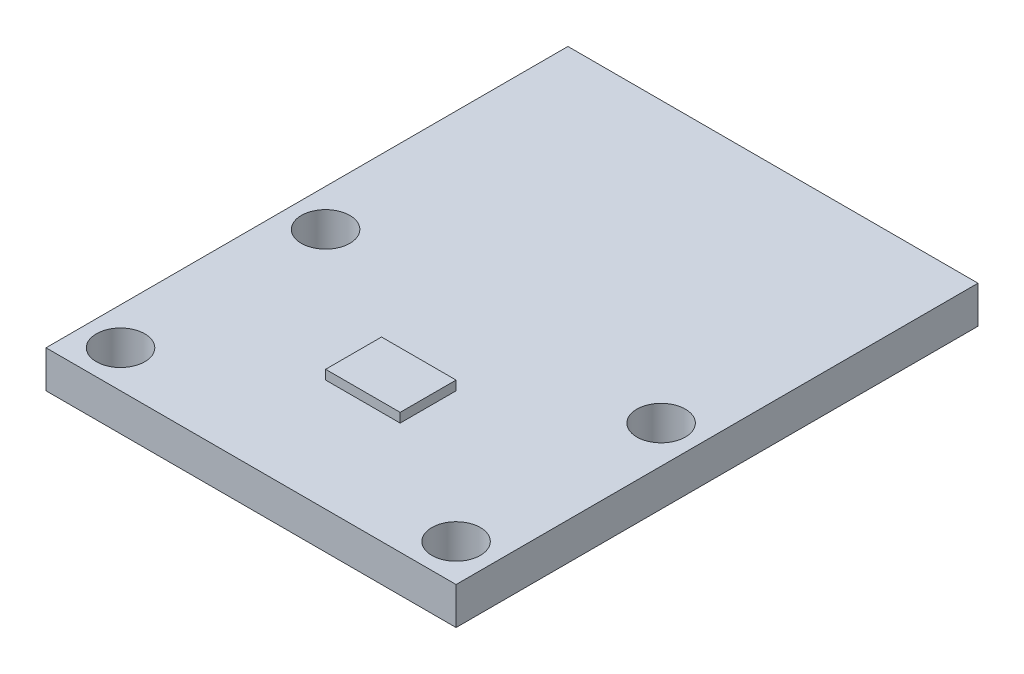
ISO-10303-21;
HEADER;
FILE_DESCRIPTION(('STEP AP214'),'2;1');
FILE_NAME('part.step','',(''),(''),'','','');
FILE_SCHEMA(('AUTOMOTIVE_DESIGN { 1 0 10303 214 1 1 1 1 }'));
ENDSEC;
DATA;
#1=APPLICATION_CONTEXT('core data for automotive mechanical design processes');
#2=APPLICATION_PROTOCOL_DEFINITION('international standard','automotive_design',2000,#1);
#3=PRODUCT_CONTEXT('',#1,'mechanical');
#4=PRODUCT('Part','Part','',(#3));
#5=PRODUCT_RELATED_PRODUCT_CATEGORY('part','',(#4));
#6=PRODUCT_DEFINITION_FORMATION('','',#4);
#7=PRODUCT_DEFINITION_CONTEXT('part definition',#1,'design');
#8=PRODUCT_DEFINITION('design','',#6,#7);
#9=PRODUCT_DEFINITION_SHAPE('','',#8);
#10=(LENGTH_UNIT() NAMED_UNIT(*) SI_UNIT(.MILLI.,.METRE.));
#11=(NAMED_UNIT(*) PLANE_ANGLE_UNIT() SI_UNIT($,.RADIAN.));
#12=(NAMED_UNIT(*) SI_UNIT($,.STERADIAN.) SOLID_ANGLE_UNIT());
#13=UNCERTAINTY_MEASURE_WITH_UNIT(LENGTH_MEASURE(1.E-05),#10,'distance_accuracy_value','');
#14=(GEOMETRIC_REPRESENTATION_CONTEXT(3) GLOBAL_UNCERTAINTY_ASSIGNED_CONTEXT((#13)) GLOBAL_UNIT_ASSIGNED_CONTEXT((#10,
#11,#12)) REPRESENTATION_CONTEXT('',''));
#15=CARTESIAN_POINT('',(0.,0.,0.));
#16=DIRECTION('',(0.,0.,1.));
#17=DIRECTION('',(1.,0.,0.));
#18=AXIS2_PLACEMENT_3D('',#15,#16,#17);
#19=CARTESIAN_POINT('',(0.,2.,0.));
#20=DIRECTION('',(0.,1.,0.));
#21=DIRECTION('',(0.,0.,1.));
#22=AXIS2_PLACEMENT_3D('',#19,#20,#21);
#23=PLANE('',#22);
#24=CARTESIAN_POINT('',(9.00000000000001,2.,1.));
#25=DIRECTION('',(0.,1.,0.));
#26=DIRECTION('',(0.,0.,1.));
#27=AXIS2_PLACEMENT_3D('',#24,#25,#26);
#28=CIRCLE('',#27,1.3);
#29=CARTESIAN_POINT('',(9.00000000000001,2.,2.3));
#30=VERTEX_POINT('',#29);
#31=EDGE_CURVE('E145',#30,#30,#28,.T.);
#32=ORIENTED_EDGE('',*,*,#31,.F.);
#33=EDGE_LOOP('',(#32));
#34=FACE_BOUND('',#33,.T.);
#35=CARTESIAN_POINT('',(9.00000000000001,2.,12.));
#36=DIRECTION('',(0.,1.,0.));
#37=DIRECTION('',(0.,0.,1.));
#38=AXIS2_PLACEMENT_3D('',#35,#36,#37);
#39=CIRCLE('',#38,1.3);
#40=CARTESIAN_POINT('',(9.00000000000001,2.,13.3));
#41=VERTEX_POINT('',#40);
#42=EDGE_CURVE('E157',#41,#41,#39,.T.);
#43=ORIENTED_EDGE('',*,*,#42,.F.);
#44=EDGE_LOOP('',(#43));
#45=FACE_BOUND('',#44,.T.);
#46=DIRECTION('',(0.,0.,-1.));
#47=VECTOR('',#46,1.);
#48=CARTESIAN_POINT('',(11.,2.,-14.));
#49=LINE('',#48,#47);
#50=CARTESIAN_POINT('',(11.,2.,14.));
#51=VERTEX_POINT('',#50);
#52=CARTESIAN_POINT('',(11.,2.,-14.));
#53=VERTEX_POINT('',#52);
#54=EDGE_CURVE('E163',#51,#53,#49,.T.);
#55=ORIENTED_EDGE('',*,*,#54,.T.);
#56=DIRECTION('',(-1.,0.,0.));
#57=VECTOR('',#56,1.);
#58=CARTESIAN_POINT('',(-11.,2.,-14.));
#59=LINE('',#58,#57);
#60=CARTESIAN_POINT('',(-11.,2.,-14.));
#61=VERTEX_POINT('',#60);
#62=EDGE_CURVE('E87',#53,#61,#59,.T.);
#63=ORIENTED_EDGE('',*,*,#62,.T.);
#64=DIRECTION('',(0.,0.,1.));
#65=VECTOR('',#64,1.);
#66=CARTESIAN_POINT('',(-11.,2.,-14.));
#67=LINE('',#66,#65);
#68=CARTESIAN_POINT('',(-11.,2.,14.));
#69=VERTEX_POINT('',#68);
#70=EDGE_CURVE('E166',#61,#69,#67,.T.);
#71=ORIENTED_EDGE('',*,*,#70,.T.);
#72=DIRECTION('',(1.,0.,0.));
#73=VECTOR('',#72,1.);
#74=CARTESIAN_POINT('',(-11.,2.,14.));
#75=LINE('',#74,#73);
#76=EDGE_CURVE('E59',#69,#51,#75,.T.);
#77=ORIENTED_EDGE('',*,*,#76,.T.);
#78=EDGE_LOOP('',(#55,#63,#71,#77));
#79=FACE_BOUND('',#78,.T.);
#80=CARTESIAN_POINT('',(-9.,2.,12.));
#81=DIRECTION('',(0.,1.,0.));
#82=DIRECTION('',(0.,0.,1.));
#83=AXIS2_PLACEMENT_3D('',#80,#81,#82);
#84=CIRCLE('',#83,1.3);
#85=CARTESIAN_POINT('',(-9.,2.,13.3));
#86=VERTEX_POINT('',#85);
#87=EDGE_CURVE('E151',#86,#86,#84,.T.);
#88=ORIENTED_EDGE('',*,*,#87,.F.);
#89=EDGE_LOOP('',(#88));
#90=FACE_BOUND('',#89,.T.);
#91=CARTESIAN_POINT('',(-9.,2.,1.));
#92=DIRECTION('',(0.,1.,0.));
#93=DIRECTION('',(0.,0.,1.));
#94=AXIS2_PLACEMENT_3D('',#91,#92,#93);
#95=CIRCLE('',#94,1.3);
#96=CARTESIAN_POINT('',(-9.,2.,2.3));
#97=VERTEX_POINT('',#96);
#98=EDGE_CURVE('E137',#97,#97,#95,.T.);
#99=ORIENTED_EDGE('',*,*,#98,.F.);
#100=EDGE_LOOP('',(#99));
#101=FACE_BOUND('',#100,.T.);
#102=DIRECTION('',(-1.,0.,0.));
#103=VECTOR('',#102,1.);
#104=CARTESIAN_POINT('',(-2.,2.,5.));
#105=LINE('',#104,#103);
#106=CARTESIAN_POINT('',(2.,2.,5.));
#107=VERTEX_POINT('',#106);
#108=CARTESIAN_POINT('',(-2.,2.,5.));
#109=VERTEX_POINT('',#108);
#110=EDGE_CURVE('E333',#107,#109,#105,.T.);
#111=ORIENTED_EDGE('',*,*,#110,.F.);
#112=DIRECTION('',(0.,0.,-1.));
#113=VECTOR('',#112,1.);
#114=CARTESIAN_POINT('',(2.,2.,5.));
#115=LINE('',#114,#113);
#116=CARTESIAN_POINT('',(2.,2.,8.));
#117=VERTEX_POINT('',#116);
#118=EDGE_CURVE('E132',#117,#107,#115,.T.);
#119=ORIENTED_EDGE('',*,*,#118,.F.);
#120=DIRECTION('',(1.,0.,0.));
#121=VECTOR('',#120,1.);
#122=CARTESIAN_POINT('',(-2.,2.,8.));
#123=LINE('',#122,#121);
#124=CARTESIAN_POINT('',(-2.,2.,8.));
#125=VERTEX_POINT('',#124);
#126=EDGE_CURVE('E128',#125,#117,#123,.T.);
#127=ORIENTED_EDGE('',*,*,#126,.F.);
#128=DIRECTION('',(0.,0.,1.));
#129=VECTOR('',#128,1.);
#130=CARTESIAN_POINT('',(-2.,2.,5.));
#131=LINE('',#130,#129);
#132=EDGE_CURVE('E330',#109,#125,#131,.T.);
#133=ORIENTED_EDGE('',*,*,#132,.F.);
#134=EDGE_LOOP('',(#111,#119,#127,#133));
#135=FACE_BOUND('',#134,.T.);
#136=ADVANCED_FACE('F35',(#34,#45,#79,#90,#101,#135),#23,.T.);
#137=CARTESIAN_POINT('',(0.,0.,0.));
#138=DIRECTION('',(0.,1.,0.));
#139=DIRECTION('',(0.,0.,1.));
#140=AXIS2_PLACEMENT_3D('',#137,#138,#139);
#141=PLANE('',#140);
#142=DIRECTION('',(0.,0.,-1.));
#143=VECTOR('',#142,1.);
#144=CARTESIAN_POINT('',(11.,0.,-14.));
#145=LINE('',#144,#143);
#146=CARTESIAN_POINT('',(11.,0.,14.));
#147=VERTEX_POINT('',#146);
#148=CARTESIAN_POINT('',(11.,0.,-14.));
#149=VERTEX_POINT('',#148);
#150=EDGE_CURVE('E160',#147,#149,#145,.T.);
#151=ORIENTED_EDGE('',*,*,#150,.F.);
#152=DIRECTION('',(1.,0.,0.));
#153=VECTOR('',#152,1.);
#154=CARTESIAN_POINT('',(-11.,0.,14.));
#155=LINE('',#154,#153);
#156=CARTESIAN_POINT('',(-11.,0.,14.));
#157=VERTEX_POINT('',#156);
#158=EDGE_CURVE('E80',#157,#147,#155,.T.);
#159=ORIENTED_EDGE('',*,*,#158,.F.);
#160=DIRECTION('',(0.,0.,1.));
#161=VECTOR('',#160,1.);
#162=CARTESIAN_POINT('',(-11.,0.,-14.));
#163=LINE('',#162,#161);
#164=CARTESIAN_POINT('',(-11.,0.,-14.));
#165=VERTEX_POINT('',#164);
#166=EDGE_CURVE('E174',#165,#157,#163,.T.);
#167=ORIENTED_EDGE('',*,*,#166,.F.);
#168=DIRECTION('',(-1.,0.,0.));
#169=VECTOR('',#168,1.);
#170=CARTESIAN_POINT('',(-11.,0.,-14.));
#171=LINE('',#170,#169);
#172=EDGE_CURVE('E172',#149,#165,#171,.T.);
#173=ORIENTED_EDGE('',*,*,#172,.F.);
#174=EDGE_LOOP('',(#151,#159,#167,#173));
#175=FACE_BOUND('',#174,.T.);
#176=CARTESIAN_POINT('',(9.00000000000001,0.,12.));
#177=DIRECTION('',(0.,1.,0.));
#178=DIRECTION('',(0.,0.,1.));
#179=AXIS2_PLACEMENT_3D('',#176,#177,#178);
#180=CIRCLE('',#179,1.3);
#181=CARTESIAN_POINT('',(9.00000000000001,0.,13.3));
#182=VERTEX_POINT('',#181);
#183=EDGE_CURVE('E154',#182,#182,#180,.T.);
#184=ORIENTED_EDGE('',*,*,#183,.T.);
#185=EDGE_LOOP('',(#184));
#186=FACE_BOUND('',#185,.T.);
#187=CARTESIAN_POINT('',(-9.,0.,12.));
#188=DIRECTION('',(0.,1.,0.));
#189=DIRECTION('',(0.,0.,1.));
#190=AXIS2_PLACEMENT_3D('',#187,#188,#189);
#191=CIRCLE('',#190,1.3);
#192=CARTESIAN_POINT('',(-9.,0.,13.3));
#193=VERTEX_POINT('',#192);
#194=EDGE_CURVE('E148',#193,#193,#191,.T.);
#195=ORIENTED_EDGE('',*,*,#194,.T.);
#196=EDGE_LOOP('',(#195));
#197=FACE_BOUND('',#196,.T.);
#198=CARTESIAN_POINT('',(9.00000000000001,0.,1.));
#199=DIRECTION('',(0.,1.,0.));
#200=DIRECTION('',(0.,0.,1.));
#201=AXIS2_PLACEMENT_3D('',#198,#199,#200);
#202=CIRCLE('',#201,1.3);
#203=CARTESIAN_POINT('',(9.00000000000001,0.,2.3));
#204=VERTEX_POINT('',#203);
#205=EDGE_CURVE('E143',#204,#204,#202,.T.);
#206=ORIENTED_EDGE('',*,*,#205,.T.);
#207=EDGE_LOOP('',(#206));
#208=FACE_BOUND('',#207,.T.);
#209=CARTESIAN_POINT('',(-9.,0.,1.));
#210=DIRECTION('',(0.,1.,0.));
#211=DIRECTION('',(0.,0.,1.));
#212=AXIS2_PLACEMENT_3D('',#209,#210,#211);
#213=CIRCLE('',#212,1.3);
#214=CARTESIAN_POINT('',(-9.,0.,2.3));
#215=VERTEX_POINT('',#214);
#216=EDGE_CURVE('E134',#215,#215,#213,.T.);
#217=ORIENTED_EDGE('',*,*,#216,.T.);
#218=EDGE_LOOP('',(#217));
#219=FACE_BOUND('',#218,.T.);
#220=ADVANCED_FACE('F187',(#175,#186,#197,#208,#219),#141,.F.);
#221=CARTESIAN_POINT('',(11.,2.,-14.));
#222=DIRECTION('',(-1.,0.,0.));
#223=DIRECTION('',(0.,0.,1.));
#224=AXIS2_PLACEMENT_3D('',#221,#222,#223);
#225=PLANE('',#224);
#226=ORIENTED_EDGE('',*,*,#150,.T.);
#227=DIRECTION('',(0.,-1.,0.));
#228=VECTOR('',#227,1.);
#229=CARTESIAN_POINT('',(11.,2.,-14.));
#230=LINE('',#229,#228);
#231=EDGE_CURVE('E11',#53,#149,#230,.T.);
#232=ORIENTED_EDGE('',*,*,#231,.F.);
#233=ORIENTED_EDGE('',*,*,#54,.F.);
#234=DIRECTION('',(0.,-1.,0.));
#235=VECTOR('',#234,1.);
#236=CARTESIAN_POINT('',(11.,2.,14.));
#237=LINE('',#236,#235);
#238=EDGE_CURVE('E169',#51,#147,#237,.T.);
#239=ORIENTED_EDGE('',*,*,#238,.T.);
#240=EDGE_LOOP('',(#226,#232,#233,#239));
#241=FACE_BOUND('',#240,.T.);
#242=ADVANCED_FACE('F37',(#241),#225,.F.);
#243=CARTESIAN_POINT('',(-11.,2.,-14.));
#244=DIRECTION('',(0.,0.,1.));
#245=DIRECTION('',(1.,0.,0.));
#246=AXIS2_PLACEMENT_3D('',#243,#244,#245);
#247=PLANE('',#246);
#248=ORIENTED_EDGE('',*,*,#172,.T.);
#249=DIRECTION('',(0.,-1.,0.));
#250=VECTOR('',#249,1.);
#251=CARTESIAN_POINT('',(-11.,2.,-14.));
#252=LINE('',#251,#250);
#253=EDGE_CURVE('E43',#61,#165,#252,.T.);
#254=ORIENTED_EDGE('',*,*,#253,.F.);
#255=ORIENTED_EDGE('',*,*,#62,.F.);
#256=ORIENTED_EDGE('',*,*,#231,.T.);
#257=EDGE_LOOP('',(#248,#254,#255,#256));
#258=FACE_BOUND('',#257,.T.);
#259=ADVANCED_FACE('F203',(#258),#247,.F.);
#260=CARTESIAN_POINT('',(-11.,2.,-14.));
#261=DIRECTION('',(1.,0.,0.));
#262=DIRECTION('',(0.,0.,-1.));
#263=AXIS2_PLACEMENT_3D('',#260,#261,#262);
#264=PLANE('',#263);
#265=ORIENTED_EDGE('',*,*,#166,.T.);
#266=DIRECTION('',(0.,-1.,0.));
#267=VECTOR('',#266,1.);
#268=CARTESIAN_POINT('',(-11.,2.,14.));
#269=LINE('',#268,#267);
#270=EDGE_CURVE('E178',#69,#157,#269,.T.);
#271=ORIENTED_EDGE('',*,*,#270,.F.);
#272=ORIENTED_EDGE('',*,*,#70,.F.);
#273=ORIENTED_EDGE('',*,*,#253,.T.);
#274=EDGE_LOOP('',(#265,#271,#272,#273));
#275=FACE_BOUND('',#274,.T.);
#276=ADVANCED_FACE('F183',(#275),#264,.F.);
#277=CARTESIAN_POINT('',(-11.,2.,14.));
#278=DIRECTION('',(0.,0.,-1.));
#279=DIRECTION('',(-1.,0.,0.));
#280=AXIS2_PLACEMENT_3D('',#277,#278,#279);
#281=PLANE('',#280);
#282=ORIENTED_EDGE('',*,*,#158,.T.);
#283=ORIENTED_EDGE('',*,*,#238,.F.);
#284=ORIENTED_EDGE('',*,*,#76,.F.);
#285=ORIENTED_EDGE('',*,*,#270,.T.);
#286=EDGE_LOOP('',(#282,#283,#284,#285));
#287=FACE_BOUND('',#286,.T.);
#288=ADVANCED_FACE('F192',(#287),#281,.F.);
#289=CARTESIAN_POINT('',(9.00000000000001,2.,12.));
#290=DIRECTION('',(0.,-1.,0.));
#291=DIRECTION('',(0.,0.,-1.));
#292=AXIS2_PLACEMENT_3D('',#289,#290,#291);
#293=CYLINDRICAL_SURFACE('',#292,1.3);
#294=ORIENTED_EDGE('',*,*,#42,.T.);
#295=EDGE_LOOP('',(#294));
#296=FACE_BOUND('',#295,.T.);
#297=ORIENTED_EDGE('',*,*,#183,.F.);
#298=EDGE_LOOP('',(#297));
#299=FACE_BOUND('',#298,.T.);
#300=ADVANCED_FACE('F194',(#296,#299),#293,.F.);
#301=CARTESIAN_POINT('',(-9.,2.,12.));
#302=DIRECTION('',(0.,-1.,0.));
#303=DIRECTION('',(0.,0.,-1.));
#304=AXIS2_PLACEMENT_3D('',#301,#302,#303);
#305=CYLINDRICAL_SURFACE('',#304,1.3);
#306=ORIENTED_EDGE('',*,*,#87,.T.);
#307=EDGE_LOOP('',(#306));
#308=FACE_BOUND('',#307,.T.);
#309=ORIENTED_EDGE('',*,*,#194,.F.);
#310=EDGE_LOOP('',(#309));
#311=FACE_BOUND('',#310,.T.);
#312=ADVANCED_FACE('F200',(#308,#311),#305,.F.);
#313=CARTESIAN_POINT('',(9.00000000000001,2.,1.));
#314=DIRECTION('',(0.,-1.,0.));
#315=DIRECTION('',(0.,0.,-1.));
#316=AXIS2_PLACEMENT_3D('',#313,#314,#315);
#317=CYLINDRICAL_SURFACE('',#316,1.3);
#318=ORIENTED_EDGE('',*,*,#31,.T.);
#319=EDGE_LOOP('',(#318));
#320=FACE_BOUND('',#319,.T.);
#321=ORIENTED_EDGE('',*,*,#205,.F.);
#322=EDGE_LOOP('',(#321));
#323=FACE_BOUND('',#322,.T.);
#324=ADVANCED_FACE('F217',(#320,#323),#317,.F.);
#325=CARTESIAN_POINT('',(-9.,2.,1.));
#326=DIRECTION('',(0.,-1.,0.));
#327=DIRECTION('',(0.,0.,-1.));
#328=AXIS2_PLACEMENT_3D('',#325,#326,#327);
#329=CYLINDRICAL_SURFACE('',#328,1.3);
#330=ORIENTED_EDGE('',*,*,#98,.T.);
#331=EDGE_LOOP('',(#330));
#332=FACE_BOUND('',#331,.T.);
#333=ORIENTED_EDGE('',*,*,#216,.F.);
#334=EDGE_LOOP('',(#333));
#335=FACE_BOUND('',#334,.T.);
#336=ADVANCED_FACE('F221',(#332,#335),#329,.F.);
#337=CARTESIAN_POINT('',(2.,2.5,5.));
#338=DIRECTION('',(-1.,0.,0.));
#339=DIRECTION('',(0.,0.,1.));
#340=AXIS2_PLACEMENT_3D('',#337,#338,#339);
#341=PLANE('',#340);
#342=ORIENTED_EDGE('',*,*,#118,.T.);
#343=DIRECTION('',(0.,-1.,0.));
#344=VECTOR('',#343,1.);
#345=CARTESIAN_POINT('',(2.,2.5,5.));
#346=LINE('',#345,#344);
#347=CARTESIAN_POINT('',(2.,2.5,5.));
#348=VERTEX_POINT('',#347);
#349=EDGE_CURVE('E113',#348,#107,#346,.T.);
#350=ORIENTED_EDGE('',*,*,#349,.F.);
#351=DIRECTION('',(0.,0.,-1.));
#352=VECTOR('',#351,1.);
#353=CARTESIAN_POINT('',(2.,2.5,5.));
#354=LINE('',#353,#352);
#355=CARTESIAN_POINT('',(2.,2.5,8.));
#356=VERTEX_POINT('',#355);
#357=EDGE_CURVE('E120',#356,#348,#354,.T.);
#358=ORIENTED_EDGE('',*,*,#357,.F.);
#359=DIRECTION('',(0.,-1.,0.));
#360=VECTOR('',#359,1.);
#361=CARTESIAN_POINT('',(2.,2.5,8.));
#362=LINE('',#361,#360);
#363=EDGE_CURVE('E327',#356,#117,#362,.T.);
#364=ORIENTED_EDGE('',*,*,#363,.T.);
#365=EDGE_LOOP('',(#342,#350,#358,#364));
#366=FACE_BOUND('',#365,.T.);
#367=ADVANCED_FACE('F130',(#366),#341,.F.);
#368=CARTESIAN_POINT('',(-2.,2.5,5.));
#369=DIRECTION('',(0.,0.,1.));
#370=DIRECTION('',(1.,0.,0.));
#371=AXIS2_PLACEMENT_3D('',#368,#369,#370);
#372=PLANE('',#371);
#373=ORIENTED_EDGE('',*,*,#110,.T.);
#374=DIRECTION('',(0.,-1.,0.));
#375=VECTOR('',#374,1.);
#376=CARTESIAN_POINT('',(-2.,2.5,5.));
#377=LINE('',#376,#375);
#378=CARTESIAN_POINT('',(-2.,2.5,5.));
#379=VERTEX_POINT('',#378);
#380=EDGE_CURVE('E116',#379,#109,#377,.T.);
#381=ORIENTED_EDGE('',*,*,#380,.F.);
#382=DIRECTION('',(-1.,0.,0.));
#383=VECTOR('',#382,1.);
#384=CARTESIAN_POINT('',(-2.,2.5,5.));
#385=LINE('',#384,#383);
#386=EDGE_CURVE('E109',#348,#379,#385,.T.);
#387=ORIENTED_EDGE('',*,*,#386,.F.);
#388=ORIENTED_EDGE('',*,*,#349,.T.);
#389=EDGE_LOOP('',(#373,#381,#387,#388));
#390=FACE_BOUND('',#389,.T.);
#391=ADVANCED_FACE('F111',(#390),#372,.F.);
#392=CARTESIAN_POINT('',(-2.,2.5,5.));
#393=DIRECTION('',(1.,0.,0.));
#394=DIRECTION('',(0.,0.,-1.));
#395=AXIS2_PLACEMENT_3D('',#392,#393,#394);
#396=PLANE('',#395);
#397=ORIENTED_EDGE('',*,*,#132,.T.);
#398=DIRECTION('',(0.,-1.,0.));
#399=VECTOR('',#398,1.);
#400=CARTESIAN_POINT('',(-2.,2.5,8.));
#401=LINE('',#400,#399);
#402=CARTESIAN_POINT('',(-2.,2.5,8.));
#403=VERTEX_POINT('',#402);
#404=EDGE_CURVE('E50',#403,#125,#401,.T.);
#405=ORIENTED_EDGE('',*,*,#404,.F.);
#406=DIRECTION('',(0.,0.,1.));
#407=VECTOR('',#406,1.);
#408=CARTESIAN_POINT('',(-2.,2.5,5.));
#409=LINE('',#408,#407);
#410=EDGE_CURVE('E119',#379,#403,#409,.T.);
#411=ORIENTED_EDGE('',*,*,#410,.F.);
#412=ORIENTED_EDGE('',*,*,#380,.T.);
#413=EDGE_LOOP('',(#397,#405,#411,#412));
#414=FACE_BOUND('',#413,.T.);
#415=ADVANCED_FACE('F230',(#414),#396,.F.);
#416=CARTESIAN_POINT('',(-2.,2.5,8.));
#417=DIRECTION('',(0.,0.,-1.));
#418=DIRECTION('',(-1.,0.,0.));
#419=AXIS2_PLACEMENT_3D('',#416,#417,#418);
#420=PLANE('',#419);
#421=ORIENTED_EDGE('',*,*,#126,.T.);
#422=ORIENTED_EDGE('',*,*,#363,.F.);
#423=DIRECTION('',(1.,0.,0.));
#424=VECTOR('',#423,1.);
#425=CARTESIAN_POINT('',(-2.,2.5,8.));
#426=LINE('',#425,#424);
#427=EDGE_CURVE('E124',#403,#356,#426,.T.);
#428=ORIENTED_EDGE('',*,*,#427,.F.);
#429=ORIENTED_EDGE('',*,*,#404,.T.);
#430=EDGE_LOOP('',(#421,#422,#428,#429));
#431=FACE_BOUND('',#430,.T.);
#432=ADVANCED_FACE('F233',(#431),#420,.F.);
#433=CARTESIAN_POINT('',(0.,2.5,0.));
#434=DIRECTION('',(0.,1.,0.));
#435=DIRECTION('',(0.,0.,1.));
#436=AXIS2_PLACEMENT_3D('',#433,#434,#435);
#437=PLANE('',#436);
#438=ORIENTED_EDGE('',*,*,#357,.T.);
#439=ORIENTED_EDGE('',*,*,#386,.T.);
#440=ORIENTED_EDGE('',*,*,#410,.T.);
#441=ORIENTED_EDGE('',*,*,#427,.T.);
#442=EDGE_LOOP('',(#438,#439,#440,#441));
#443=FACE_BOUND('',#442,.T.);
#444=ADVANCED_FACE('F123',(#443),#437,.T.);
#445=CLOSED_SHELL('',(#136,#220,#242,#259,#276,#288,#300,#312,#324,#336,#367,#391,#415,#432,#444));
#446=MANIFOLD_SOLID_BREP('B2',#445);
#447=ADVANCED_BREP_SHAPE_REPRESENTATION('',(#18,#446),#14);
#448=SHAPE_DEFINITION_REPRESENTATION(#9,#447);
ENDSEC;
END-ISO-10303-21;
